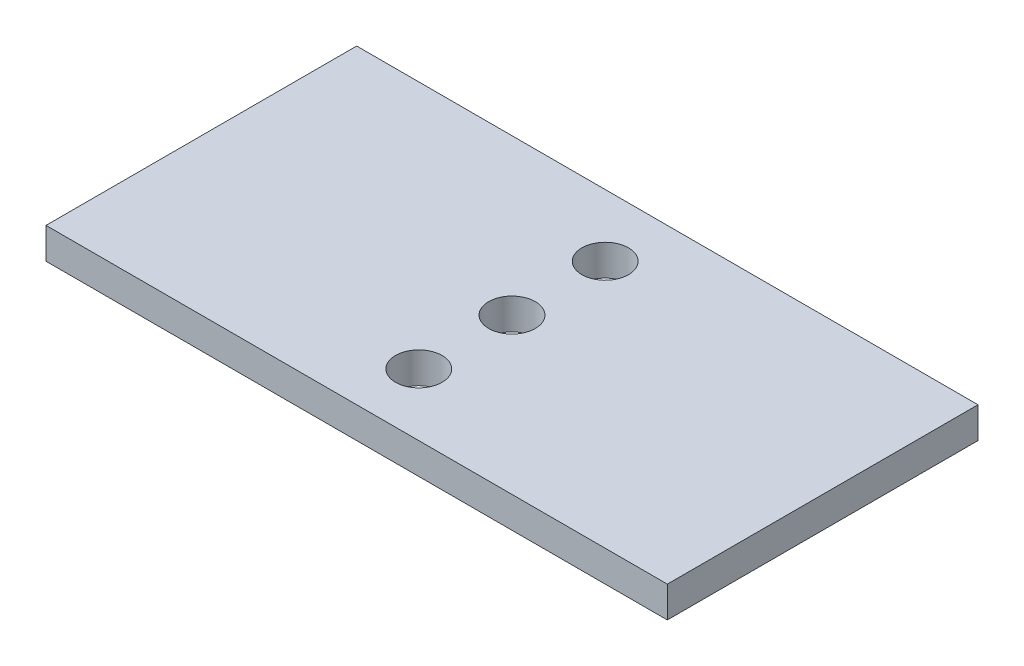
ISO-10303-21;
HEADER;
FILE_DESCRIPTION(('STEP AP214'),'2;1');
FILE_NAME('part.step','',(''),(''),'','','');
FILE_SCHEMA(('AUTOMOTIVE_DESIGN { 1 0 10303 214 1 1 1 1 }'));
ENDSEC;
DATA;
#1=APPLICATION_CONTEXT('core data for automotive mechanical design processes');
#2=APPLICATION_PROTOCOL_DEFINITION('international standard','automotive_design',2000,#1);
#3=PRODUCT_CONTEXT('',#1,'mechanical');
#4=PRODUCT('Part','Part','',(#3));
#5=PRODUCT_RELATED_PRODUCT_CATEGORY('part','',(#4));
#6=PRODUCT_DEFINITION_FORMATION('','',#4);
#7=PRODUCT_DEFINITION_CONTEXT('part definition',#1,'design');
#8=PRODUCT_DEFINITION('design','',#6,#7);
#9=PRODUCT_DEFINITION_SHAPE('','',#8);
#10=(LENGTH_UNIT() NAMED_UNIT(*) SI_UNIT(.MILLI.,.METRE.));
#11=(NAMED_UNIT(*) PLANE_ANGLE_UNIT() SI_UNIT($,.RADIAN.));
#12=(NAMED_UNIT(*) SI_UNIT($,.STERADIAN.) SOLID_ANGLE_UNIT());
#13=UNCERTAINTY_MEASURE_WITH_UNIT(LENGTH_MEASURE(1.E-05),#10,'distance_accuracy_value','');
#14=(GEOMETRIC_REPRESENTATION_CONTEXT(3) GLOBAL_UNCERTAINTY_ASSIGNED_CONTEXT((#13)) GLOBAL_UNIT_ASSIGNED_CONTEXT((#10,
#11,#12)) REPRESENTATION_CONTEXT('',''));
#15=CARTESIAN_POINT('',(0.,0.,0.));
#16=DIRECTION('',(0.,0.,1.));
#17=DIRECTION('',(1.,0.,0.));
#18=AXIS2_PLACEMENT_3D('',#15,#16,#17);
#19=CARTESIAN_POINT('',(0.,10.,0.));
#20=DIRECTION('',(0.,1.,0.));
#21=DIRECTION('',(0.,0.,1.));
#22=AXIS2_PLACEMENT_3D('',#19,#20,#21);
#23=PLANE('',#22);
#24=CARTESIAN_POINT('',(0.,10.,-30.));
#25=DIRECTION('',(0.,1.,0.));
#26=DIRECTION('',(0.,0.,1.));
#27=AXIS2_PLACEMENT_3D('',#24,#25,#26);
#28=CIRCLE('',#27,7.5);
#29=CARTESIAN_POINT('',(0.,10.,-22.5));
#30=VERTEX_POINT('',#29);
#31=EDGE_CURVE('E147',#30,#30,#28,.T.);
#32=ORIENTED_EDGE('',*,*,#31,.F.);
#33=EDGE_LOOP('',(#32));
#34=FACE_BOUND('',#33,.T.);
#35=DIRECTION('',(0.,0.,1.));
#36=VECTOR('',#35,1.);
#37=CARTESIAN_POINT('',(-100.,10.,50.));
#38=LINE('',#37,#36);
#39=CARTESIAN_POINT('',(-100.,10.,-50.));
#40=VERTEX_POINT('',#39);
#41=CARTESIAN_POINT('',(-100.,10.,50.));
#42=VERTEX_POINT('',#41);
#43=EDGE_CURVE('E97',#40,#42,#38,.T.);
#44=ORIENTED_EDGE('',*,*,#43,.T.);
#45=DIRECTION('',(1.,0.,0.));
#46=VECTOR('',#45,1.);
#47=CARTESIAN_POINT('',(100.,10.,50.));
#48=LINE('',#47,#46);
#49=CARTESIAN_POINT('',(100.,10.,50.));
#50=VERTEX_POINT('',#49);
#51=EDGE_CURVE('E92',#42,#50,#48,.T.);
#52=ORIENTED_EDGE('',*,*,#51,.T.);
#53=DIRECTION('',(0.,0.,-1.));
#54=VECTOR('',#53,1.);
#55=CARTESIAN_POINT('',(100.,10.,50.));
#56=LINE('',#55,#54);
#57=CARTESIAN_POINT('',(100.,10.,-50.));
#58=VERTEX_POINT('',#57);
#59=EDGE_CURVE('E95',#50,#58,#56,.T.);
#60=ORIENTED_EDGE('',*,*,#59,.T.);
#61=DIRECTION('',(-1.,0.,0.));
#62=VECTOR('',#61,1.);
#63=CARTESIAN_POINT('',(100.,10.,-50.));
#64=LINE('',#63,#62);
#65=EDGE_CURVE('E62',#58,#40,#64,.T.);
#66=ORIENTED_EDGE('',*,*,#65,.T.);
#67=EDGE_LOOP('',(#44,#52,#60,#66));
#68=FACE_BOUND('',#67,.T.);
#69=CARTESIAN_POINT('',(0.,10.,0.));
#70=DIRECTION('',(0.,1.,0.));
#71=DIRECTION('',(0.,0.,1.));
#72=AXIS2_PLACEMENT_3D('',#69,#70,#71);
#73=CIRCLE('',#72,7.5);
#74=CARTESIAN_POINT('',(0.,10.,7.49999999999998));
#75=VERTEX_POINT('',#74);
#76=EDGE_CURVE('E138',#75,#75,#73,.T.);
#77=ORIENTED_EDGE('',*,*,#76,.F.);
#78=EDGE_LOOP('',(#77));
#79=FACE_BOUND('',#78,.T.);
#80=CARTESIAN_POINT('',(0.,10.,30.));
#81=DIRECTION('',(0.,1.,0.));
#82=DIRECTION('',(0.,0.,1.));
#83=AXIS2_PLACEMENT_3D('',#80,#81,#82);
#84=CIRCLE('',#83,7.5);
#85=CARTESIAN_POINT('',(0.,10.,37.5));
#86=VERTEX_POINT('',#85);
#87=EDGE_CURVE('E158',#86,#86,#84,.T.);
#88=ORIENTED_EDGE('',*,*,#87,.F.);
#89=EDGE_LOOP('',(#88));
#90=FACE_BOUND('',#89,.T.);
#91=ADVANCED_FACE('F44',(#34,#68,#79,#90),#23,.T.);
#92=CARTESIAN_POINT('',(0.,0.,0.));
#93=DIRECTION('',(0.,1.,0.));
#94=DIRECTION('',(0.,0.,1.));
#95=AXIS2_PLACEMENT_3D('',#92,#93,#94);
#96=PLANE('',#95);
#97=DIRECTION('',(0.,0.,1.));
#98=VECTOR('',#97,1.);
#99=CARTESIAN_POINT('',(-100.,0.,50.));
#100=LINE('',#99,#98);
#101=CARTESIAN_POINT('',(-100.,0.,-50.));
#102=VERTEX_POINT('',#101);
#103=CARTESIAN_POINT('',(-100.,0.,50.));
#104=VERTEX_POINT('',#103);
#105=EDGE_CURVE('E114',#102,#104,#100,.T.);
#106=ORIENTED_EDGE('',*,*,#105,.F.);
#107=DIRECTION('',(-1.,0.,0.));
#108=VECTOR('',#107,1.);
#109=CARTESIAN_POINT('',(100.,0.,-50.));
#110=LINE('',#109,#108);
#111=CARTESIAN_POINT('',(100.,0.,-50.));
#112=VERTEX_POINT('',#111);
#113=EDGE_CURVE('E85',#112,#102,#110,.T.);
#114=ORIENTED_EDGE('',*,*,#113,.F.);
#115=DIRECTION('',(0.,0.,-1.));
#116=VECTOR('',#115,1.);
#117=CARTESIAN_POINT('',(100.,0.,50.));
#118=LINE('',#117,#116);
#119=CARTESIAN_POINT('',(100.,0.,50.));
#120=VERTEX_POINT('',#119);
#121=EDGE_CURVE('E79',#120,#112,#118,.T.);
#122=ORIENTED_EDGE('',*,*,#121,.F.);
#123=DIRECTION('',(1.,0.,0.));
#124=VECTOR('',#123,1.);
#125=CARTESIAN_POINT('',(100.,0.,50.));
#126=LINE('',#125,#124);
#127=EDGE_CURVE('E102',#104,#120,#126,.T.);
#128=ORIENTED_EDGE('',*,*,#127,.F.);
#129=EDGE_LOOP('',(#106,#114,#122,#128));
#130=FACE_BOUND('',#129,.T.);
#131=CARTESIAN_POINT('',(0.,0.,0.));
#132=DIRECTION('',(0.,1.,0.));
#133=DIRECTION('',(0.,0.,1.));
#134=AXIS2_PLACEMENT_3D('',#131,#132,#133);
#135=CIRCLE('',#134,7.5);
#136=CARTESIAN_POINT('',(0.,0.,7.49999999999998));
#137=VERTEX_POINT('',#136);
#138=EDGE_CURVE('E142',#137,#137,#135,.T.);
#139=ORIENTED_EDGE('',*,*,#138,.T.);
#140=EDGE_LOOP('',(#139));
#141=FACE_BOUND('',#140,.T.);
#142=CARTESIAN_POINT('',(0.,0.,-30.));
#143=DIRECTION('',(0.,1.,0.));
#144=DIRECTION('',(0.,0.,1.));
#145=AXIS2_PLACEMENT_3D('',#142,#143,#144);
#146=CIRCLE('',#145,7.5);
#147=CARTESIAN_POINT('',(0.,0.,-22.5));
#148=VERTEX_POINT('',#147);
#149=EDGE_CURVE('E151',#148,#148,#146,.T.);
#150=ORIENTED_EDGE('',*,*,#149,.T.);
#151=EDGE_LOOP('',(#150));
#152=FACE_BOUND('',#151,.T.);
#153=CARTESIAN_POINT('',(0.,0.,30.));
#154=DIRECTION('',(0.,1.,0.));
#155=DIRECTION('',(0.,0.,1.));
#156=AXIS2_PLACEMENT_3D('',#153,#154,#155);
#157=CIRCLE('',#156,7.5);
#158=CARTESIAN_POINT('',(0.,0.,37.5));
#159=VERTEX_POINT('',#158);
#160=EDGE_CURVE('E162',#159,#159,#157,.T.);
#161=ORIENTED_EDGE('',*,*,#160,.T.);
#162=EDGE_LOOP('',(#161));
#163=FACE_BOUND('',#162,.T.);
#164=ADVANCED_FACE('F133',(#130,#141,#152,#163),#96,.F.);
#165=CARTESIAN_POINT('',(-100.,10.,50.));
#166=DIRECTION('',(1.,0.,0.));
#167=DIRECTION('',(0.,0.,-1.));
#168=AXIS2_PLACEMENT_3D('',#165,#166,#167);
#169=PLANE('',#168);
#170=ORIENTED_EDGE('',*,*,#105,.T.);
#171=DIRECTION('',(0.,-1.,0.));
#172=VECTOR('',#171,1.);
#173=CARTESIAN_POINT('',(-100.,10.,50.));
#174=LINE('',#173,#172);
#175=EDGE_CURVE('E12',#42,#104,#174,.T.);
#176=ORIENTED_EDGE('',*,*,#175,.F.);
#177=ORIENTED_EDGE('',*,*,#43,.F.);
#178=DIRECTION('',(0.,-1.,0.));
#179=VECTOR('',#178,1.);
#180=CARTESIAN_POINT('',(-100.,10.,-50.));
#181=LINE('',#180,#179);
#182=EDGE_CURVE('E109',#40,#102,#181,.T.);
#183=ORIENTED_EDGE('',*,*,#182,.T.);
#184=EDGE_LOOP('',(#170,#176,#177,#183));
#185=FACE_BOUND('',#184,.T.);
#186=ADVANCED_FACE('F46',(#185),#169,.F.);
#187=CARTESIAN_POINT('',(100.,10.,50.));
#188=DIRECTION('',(0.,0.,-1.));
#189=DIRECTION('',(-1.,0.,0.));
#190=AXIS2_PLACEMENT_3D('',#187,#188,#189);
#191=PLANE('',#190);
#192=ORIENTED_EDGE('',*,*,#127,.T.);
#193=DIRECTION('',(0.,-1.,0.));
#194=VECTOR('',#193,1.);
#195=CARTESIAN_POINT('',(100.,10.,50.));
#196=LINE('',#195,#194);
#197=EDGE_CURVE('E54',#50,#120,#196,.T.);
#198=ORIENTED_EDGE('',*,*,#197,.F.);
#199=ORIENTED_EDGE('',*,*,#51,.F.);
#200=ORIENTED_EDGE('',*,*,#175,.T.);
#201=EDGE_LOOP('',(#192,#198,#199,#200));
#202=FACE_BOUND('',#201,.T.);
#203=ADVANCED_FACE('F101',(#202),#191,.F.);
#204=CARTESIAN_POINT('',(100.,10.,50.));
#205=DIRECTION('',(-1.,0.,0.));
#206=DIRECTION('',(0.,0.,1.));
#207=AXIS2_PLACEMENT_3D('',#204,#205,#206);
#208=PLANE('',#207);
#209=ORIENTED_EDGE('',*,*,#121,.T.);
#210=DIRECTION('',(0.,-1.,0.));
#211=VECTOR('',#210,1.);
#212=CARTESIAN_POINT('',(100.,10.,-50.));
#213=LINE('',#212,#211);
#214=EDGE_CURVE('E104',#58,#112,#213,.T.);
#215=ORIENTED_EDGE('',*,*,#214,.F.);
#216=ORIENTED_EDGE('',*,*,#59,.F.);
#217=ORIENTED_EDGE('',*,*,#197,.T.);
#218=EDGE_LOOP('',(#209,#215,#216,#217));
#219=FACE_BOUND('',#218,.T.);
#220=ADVANCED_FACE('F105',(#219),#208,.F.);
#221=CARTESIAN_POINT('',(100.,10.,-50.));
#222=DIRECTION('',(0.,0.,1.));
#223=DIRECTION('',(1.,0.,0.));
#224=AXIS2_PLACEMENT_3D('',#221,#222,#223);
#225=PLANE('',#224);
#226=ORIENTED_EDGE('',*,*,#113,.T.);
#227=ORIENTED_EDGE('',*,*,#182,.F.);
#228=ORIENTED_EDGE('',*,*,#65,.F.);
#229=ORIENTED_EDGE('',*,*,#214,.T.);
#230=EDGE_LOOP('',(#226,#227,#228,#229));
#231=FACE_BOUND('',#230,.T.);
#232=ADVANCED_FACE('F130',(#231),#225,.F.);
#233=CARTESIAN_POINT('',(0.,10.,0.));
#234=DIRECTION('',(0.,-1.,0.));
#235=DIRECTION('',(0.,0.,-1.));
#236=AXIS2_PLACEMENT_3D('',#233,#234,#235);
#237=CYLINDRICAL_SURFACE('',#236,7.5);
#238=ORIENTED_EDGE('',*,*,#76,.T.);
#239=EDGE_LOOP('',(#238));
#240=FACE_BOUND('',#239,.T.);
#241=ORIENTED_EDGE('',*,*,#138,.F.);
#242=EDGE_LOOP('',(#241));
#243=FACE_BOUND('',#242,.T.);
#244=ADVANCED_FACE('F182',(#240,#243),#237,.F.);
#245=CARTESIAN_POINT('',(0.,10.,-30.));
#246=DIRECTION('',(0.,-1.,0.));
#247=DIRECTION('',(0.,0.,-1.));
#248=AXIS2_PLACEMENT_3D('',#245,#246,#247);
#249=CYLINDRICAL_SURFACE('',#248,7.5);
#250=ORIENTED_EDGE('',*,*,#31,.T.);
#251=EDGE_LOOP('',(#250));
#252=FACE_BOUND('',#251,.T.);
#253=ORIENTED_EDGE('',*,*,#149,.F.);
#254=EDGE_LOOP('',(#253));
#255=FACE_BOUND('',#254,.T.);
#256=ADVANCED_FACE('F228',(#252,#255),#249,.F.);
#257=CARTESIAN_POINT('',(0.,10.,30.));
#258=DIRECTION('',(0.,-1.,0.));
#259=DIRECTION('',(0.,0.,-1.));
#260=AXIS2_PLACEMENT_3D('',#257,#258,#259);
#261=CYLINDRICAL_SURFACE('',#260,7.5);
#262=ORIENTED_EDGE('',*,*,#87,.T.);
#263=EDGE_LOOP('',(#262));
#264=FACE_BOUND('',#263,.T.);
#265=ORIENTED_EDGE('',*,*,#160,.F.);
#266=EDGE_LOOP('',(#265));
#267=FACE_BOUND('',#266,.T.);
#268=ADVANCED_FACE('F170',(#264,#267),#261,.F.);
#269=CLOSED_SHELL('',(#91,#164,#186,#203,#220,#232,#244,#256,#268));
#270=MANIFOLD_SOLID_BREP('B2',#269);
#271=ADVANCED_BREP_SHAPE_REPRESENTATION('',(#18,#270),#14);
#272=SHAPE_DEFINITION_REPRESENTATION(#9,#271);
ENDSEC;
END-ISO-10303-21;
